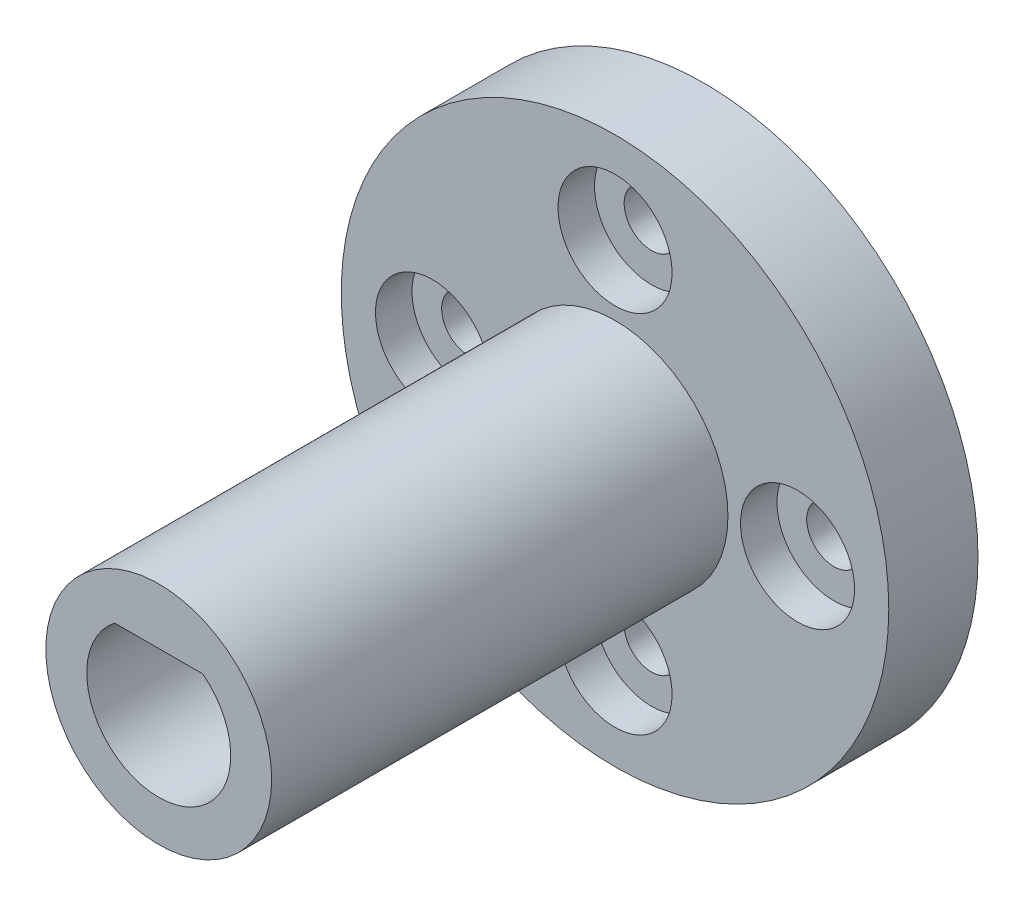
ISO-10303-21;
HEADER;
FILE_DESCRIPTION(('STEP AP214'),'2;1');
FILE_NAME('part.step','',(''),(''),'','','');
FILE_SCHEMA(('AUTOMOTIVE_DESIGN { 1 0 10303 214 1 1 1 1 }'));
ENDSEC;
DATA;
#1=APPLICATION_CONTEXT('core data for automotive mechanical design processes');
#2=APPLICATION_PROTOCOL_DEFINITION('international standard','automotive_design',2000,#1);
#3=PRODUCT_CONTEXT('',#1,'mechanical');
#4=PRODUCT('Part','Part','',(#3));
#5=PRODUCT_RELATED_PRODUCT_CATEGORY('part','',(#4));
#6=PRODUCT_DEFINITION_FORMATION('','',#4);
#7=PRODUCT_DEFINITION_CONTEXT('part definition',#1,'design');
#8=PRODUCT_DEFINITION('design','',#6,#7);
#9=PRODUCT_DEFINITION_SHAPE('','',#8);
#10=(LENGTH_UNIT() NAMED_UNIT(*) SI_UNIT(.MILLI.,.METRE.));
#11=(NAMED_UNIT(*) PLANE_ANGLE_UNIT() SI_UNIT($,.RADIAN.));
#12=(NAMED_UNIT(*) SI_UNIT($,.STERADIAN.) SOLID_ANGLE_UNIT());
#13=UNCERTAINTY_MEASURE_WITH_UNIT(LENGTH_MEASURE(1.E-05),#10,'distance_accuracy_value','');
#14=(GEOMETRIC_REPRESENTATION_CONTEXT(3) GLOBAL_UNCERTAINTY_ASSIGNED_CONTEXT((#13)) GLOBAL_UNIT_ASSIGNED_CONTEXT((#10,
#11,#12)) REPRESENTATION_CONTEXT('',''));
#15=CARTESIAN_POINT('',(0.,0.,0.));
#16=DIRECTION('',(0.,0.,1.));
#17=DIRECTION('',(1.,0.,0.));
#18=AXIS2_PLACEMENT_3D('',#15,#16,#17);
#19=CARTESIAN_POINT('',(0.,0.,3.91));
#20=DIRECTION('',(0.,0.,-1.));
#21=DIRECTION('',(-1.,0.,0.));
#22=AXIS2_PLACEMENT_3D('',#19,#20,#21);
#23=CYLINDRICAL_SURFACE('',#22,12.);
#24=CARTESIAN_POINT('',(0.,0.,3.91));
#25=DIRECTION('',(0.,0.,1.));
#26=DIRECTION('',(1.,0.,0.));
#27=AXIS2_PLACEMENT_3D('',#24,#25,#26);
#28=CIRCLE('',#27,12.);
#29=CARTESIAN_POINT('',(12.,0.,3.91));
#30=VERTEX_POINT('',#29);
#31=EDGE_CURVE('E11',#30,#30,#28,.T.);
#32=ORIENTED_EDGE('',*,*,#31,.F.);
#33=EDGE_LOOP('',(#32));
#34=FACE_BOUND('',#33,.T.);
#35=CARTESIAN_POINT('',(0.,0.,0.));
#36=DIRECTION('',(0.,0.,1.));
#37=DIRECTION('',(1.,0.,0.));
#38=AXIS2_PLACEMENT_3D('',#35,#36,#37);
#39=CIRCLE('',#38,12.);
#40=CARTESIAN_POINT('',(12.,0.,0.));
#41=VERTEX_POINT('',#40);
#42=EDGE_CURVE('E39',#41,#41,#39,.T.);
#43=ORIENTED_EDGE('',*,*,#42,.T.);
#44=EDGE_LOOP('',(#43));
#45=FACE_BOUND('',#44,.T.);
#46=ADVANCED_FACE('F36',(#34,#45),#23,.T.);
#47=CARTESIAN_POINT('',(0.,0.,3.91));
#48=DIRECTION('',(0.,0.,1.));
#49=DIRECTION('',(1.,0.,0.));
#50=AXIS2_PLACEMENT_3D('',#47,#48,#49);
#51=PLANE('',#50);
#52=CARTESIAN_POINT('',(8.,0.,3.91));
#53=DIRECTION('',(0.,0.,1.));
#54=DIRECTION('',(1.,0.,0.));
#55=AXIS2_PLACEMENT_3D('',#52,#53,#54);
#56=CIRCLE('',#55,2.5);
#57=CARTESIAN_POINT('',(10.5,0.,3.91));
#58=VERTEX_POINT('',#57);
#59=EDGE_CURVE('E306',#58,#58,#56,.T.);
#60=ORIENTED_EDGE('',*,*,#59,.F.);
#61=EDGE_LOOP('',(#60));
#62=FACE_BOUND('',#61,.T.);
#63=CARTESIAN_POINT('',(0.,-8.,3.91));
#64=DIRECTION('',(0.,0.,1.));
#65=DIRECTION('',(1.,0.,0.));
#66=AXIS2_PLACEMENT_3D('',#63,#64,#65);
#67=CIRCLE('',#66,2.5);
#68=CARTESIAN_POINT('',(2.5,-8.,3.91));
#69=VERTEX_POINT('',#68);
#70=EDGE_CURVE('E316',#69,#69,#67,.T.);
#71=ORIENTED_EDGE('',*,*,#70,.F.);
#72=EDGE_LOOP('',(#71));
#73=FACE_BOUND('',#72,.T.);
#74=CARTESIAN_POINT('',(-8.,0.,3.91));
#75=DIRECTION('',(0.,0.,1.));
#76=DIRECTION('',(1.,0.,0.));
#77=AXIS2_PLACEMENT_3D('',#74,#75,#76);
#78=CIRCLE('',#77,2.5);
#79=CARTESIAN_POINT('',(-5.50000000000001,0.,3.91));
#80=VERTEX_POINT('',#79);
#81=EDGE_CURVE('E328',#80,#80,#78,.T.);
#82=ORIENTED_EDGE('',*,*,#81,.F.);
#83=EDGE_LOOP('',(#82));
#84=FACE_BOUND('',#83,.T.);
#85=CARTESIAN_POINT('',(0.,8.,3.91));
#86=DIRECTION('',(0.,0.,1.));
#87=DIRECTION('',(1.,0.,0.));
#88=AXIS2_PLACEMENT_3D('',#85,#86,#87);
#89=CIRCLE('',#88,2.5);
#90=CARTESIAN_POINT('',(2.5,8.,3.91));
#91=VERTEX_POINT('',#90);
#92=EDGE_CURVE('E340',#91,#91,#89,.T.);
#93=ORIENTED_EDGE('',*,*,#92,.F.);
#94=EDGE_LOOP('',(#93));
#95=FACE_BOUND('',#94,.T.);
#96=CARTESIAN_POINT('',(0.,0.,3.91));
#97=DIRECTION('',(0.,0.,1.));
#98=DIRECTION('',(1.,0.,0.));
#99=AXIS2_PLACEMENT_3D('',#96,#97,#98);
#100=CIRCLE('',#99,4.95);
#101=CARTESIAN_POINT('',(4.95,0.,3.91));
#102=VERTEX_POINT('',#101);
#103=EDGE_CURVE('E76',#102,#102,#100,.T.);
#104=ORIENTED_EDGE('',*,*,#103,.F.);
#105=EDGE_LOOP('',(#104));
#106=FACE_BOUND('',#105,.T.);
#107=ORIENTED_EDGE('',*,*,#31,.T.);
#108=EDGE_LOOP('',(#107));
#109=FACE_BOUND('',#108,.T.);
#110=ADVANCED_FACE('F95',(#62,#73,#84,#95,#106,#109),#51,.T.);
#111=CARTESIAN_POINT('',(0.,0.,0.));
#112=DIRECTION('',(0.,0.,1.));
#113=DIRECTION('',(1.,0.,0.));
#114=AXIS2_PLACEMENT_3D('',#111,#112,#113);
#115=PLANE('',#114);
#116=CARTESIAN_POINT('',(8.,0.,0.));
#117=DIRECTION('',(0.,0.,1.));
#118=DIRECTION('',(1.,0.,0.));
#119=AXIS2_PLACEMENT_3D('',#116,#117,#118);
#120=CIRCLE('',#119,1.2);
#121=CARTESIAN_POINT('',(9.2,0.,0.));
#122=VERTEX_POINT('',#121);
#123=EDGE_CURVE('E313',#122,#122,#120,.T.);
#124=ORIENTED_EDGE('',*,*,#123,.T.);
#125=EDGE_LOOP('',(#124));
#126=FACE_BOUND('',#125,.T.);
#127=CARTESIAN_POINT('',(0.,-8.,0.));
#128=DIRECTION('',(0.,0.,1.));
#129=DIRECTION('',(1.,0.,0.));
#130=AXIS2_PLACEMENT_3D('',#127,#128,#129);
#131=CIRCLE('',#130,1.2);
#132=CARTESIAN_POINT('',(1.2,-8.,0.));
#133=VERTEX_POINT('',#132);
#134=EDGE_CURVE('E325',#133,#133,#131,.T.);
#135=ORIENTED_EDGE('',*,*,#134,.T.);
#136=EDGE_LOOP('',(#135));
#137=FACE_BOUND('',#136,.T.);
#138=CARTESIAN_POINT('',(-8.,0.,0.));
#139=DIRECTION('',(0.,0.,1.));
#140=DIRECTION('',(1.,0.,0.));
#141=AXIS2_PLACEMENT_3D('',#138,#139,#140);
#142=CIRCLE('',#141,1.2);
#143=CARTESIAN_POINT('',(-6.8,0.,0.));
#144=VERTEX_POINT('',#143);
#145=EDGE_CURVE('E337',#144,#144,#142,.T.);
#146=ORIENTED_EDGE('',*,*,#145,.T.);
#147=EDGE_LOOP('',(#146));
#148=FACE_BOUND('',#147,.T.);
#149=CARTESIAN_POINT('',(0.,8.,0.));
#150=DIRECTION('',(0.,0.,1.));
#151=DIRECTION('',(1.,0.,0.));
#152=AXIS2_PLACEMENT_3D('',#149,#150,#151);
#153=CIRCLE('',#152,1.2);
#154=CARTESIAN_POINT('',(1.2,8.,0.));
#155=VERTEX_POINT('',#154);
#156=EDGE_CURVE('E66',#155,#155,#153,.T.);
#157=ORIENTED_EDGE('',*,*,#156,.T.);
#158=EDGE_LOOP('',(#157));
#159=FACE_BOUND('',#158,.T.);
#160=CARTESIAN_POINT('',(0.,0.,0.));
#161=DIRECTION('',(0.,0.,-1.));
#162=DIRECTION('',(-1.,0.,0.));
#163=AXIS2_PLACEMENT_3D('',#160,#161,#162);
#164=CIRCLE('',#163,4.);
#165=CARTESIAN_POINT('',(-4.,0.,0.));
#166=VERTEX_POINT('',#165);
#167=EDGE_CURVE('E83',#166,#166,#164,.T.);
#168=ORIENTED_EDGE('',*,*,#167,.F.);
#169=EDGE_LOOP('',(#168));
#170=FACE_BOUND('',#169,.T.);
#171=ORIENTED_EDGE('',*,*,#42,.F.);
#172=EDGE_LOOP('',(#171));
#173=FACE_BOUND('',#172,.T.);
#174=ADVANCED_FACE('F92',(#126,#137,#148,#159,#170,#173),#115,.F.);
#175=CARTESIAN_POINT('',(0.,0.,1.91));
#176=DIRECTION('',(0.,0.,-1.));
#177=DIRECTION('',(-1.,0.,0.));
#178=AXIS2_PLACEMENT_3D('',#175,#176,#177);
#179=CYLINDRICAL_SURFACE('',#178,4.);
#180=CARTESIAN_POINT('',(0.,0.,1.91));
#181=DIRECTION('',(0.,0.,-1.));
#182=DIRECTION('',(-1.,0.,0.));
#183=AXIS2_PLACEMENT_3D('',#180,#181,#182);
#184=CIRCLE('',#183,4.);
#185=CARTESIAN_POINT('',(-4.,0.,1.91));
#186=VERTEX_POINT('',#185);
#187=EDGE_CURVE('E84',#186,#186,#184,.T.);
#188=CARTESIAN_POINT('',(-4.,0.,1.91));
#189=CARTESIAN_POINT('',(-4.,0.,1.89010416666667));
#190=CARTESIAN_POINT('',(-4.,0.,1.87020833333333));
#191=CARTESIAN_POINT('',(-4.,0.,1.83041666666667));
#192=CARTESIAN_POINT('',(-4.,0.,1.81052083333333));
#193=CARTESIAN_POINT('',(-4.,0.,1.77072916666667));
#194=CARTESIAN_POINT('',(-4.,0.,1.75083333333333));
#195=CARTESIAN_POINT('',(-4.,0.,1.71104166666667));
#196=CARTESIAN_POINT('',(-4.,0.,1.69114583333333));
#197=CARTESIAN_POINT('',(-4.,0.,1.65135416666667));
#198=CARTESIAN_POINT('',(-4.,0.,1.63145833333333));
#199=CARTESIAN_POINT('',(-4.,0.,1.59166666666667));
#200=CARTESIAN_POINT('',(-4.,0.,1.57177083333333));
#201=CARTESIAN_POINT('',(-4.,0.,1.53197916666667));
#202=CARTESIAN_POINT('',(-4.,0.,1.51208333333333));
#203=CARTESIAN_POINT('',(-4.,0.,1.47229166666667));
#204=CARTESIAN_POINT('',(-4.,0.,1.45239583333333));
#205=CARTESIAN_POINT('',(-4.,0.,1.41260416666667));
#206=CARTESIAN_POINT('',(-4.,0.,1.39270833333333));
#207=CARTESIAN_POINT('',(-4.,0.,1.35291666666667));
#208=CARTESIAN_POINT('',(-4.,0.,1.33302083333333));
#209=CARTESIAN_POINT('',(-4.,0.,1.29322916666667));
#210=CARTESIAN_POINT('',(-4.,0.,1.27333333333333));
#211=CARTESIAN_POINT('',(-4.,0.,1.23354166666667));
#212=CARTESIAN_POINT('',(-4.,0.,1.21364583333333));
#213=CARTESIAN_POINT('',(-4.,0.,1.17385416666667));
#214=CARTESIAN_POINT('',(-4.,0.,1.15395833333333));
#215=CARTESIAN_POINT('',(-4.,0.,1.11416666666667));
#216=CARTESIAN_POINT('',(-4.,0.,1.09427083333333));
#217=CARTESIAN_POINT('',(-4.,0.,1.05447916666667));
#218=CARTESIAN_POINT('',(-4.,0.,1.03458333333333));
#219=CARTESIAN_POINT('',(-4.,0.,0.994791666666667));
#220=CARTESIAN_POINT('',(-4.,0.,0.974895833333334));
#221=CARTESIAN_POINT('',(-4.,0.,0.935104166666667));
#222=CARTESIAN_POINT('',(-4.,0.,0.915208333333333));
#223=CARTESIAN_POINT('',(-4.,0.,0.875416666666667));
#224=CARTESIAN_POINT('',(-4.,0.,0.855520833333333));
#225=CARTESIAN_POINT('',(-4.,0.,0.815729166666667));
#226=CARTESIAN_POINT('',(-4.,0.,0.795833333333333));
#227=CARTESIAN_POINT('',(-4.,0.,0.756041666666667));
#228=CARTESIAN_POINT('',(-4.,0.,0.736145833333333));
#229=CARTESIAN_POINT('',(-4.,0.,0.696354166666667));
#230=CARTESIAN_POINT('',(-4.,0.,0.676458333333333));
#231=CARTESIAN_POINT('',(-4.,0.,0.636666666666667));
#232=CARTESIAN_POINT('',(-4.,0.,0.616770833333333));
#233=CARTESIAN_POINT('',(-4.,0.,0.576979166666667));
#234=CARTESIAN_POINT('',(-4.,0.,0.557083333333333));
#235=CARTESIAN_POINT('',(-4.,0.,0.517291666666667));
#236=CARTESIAN_POINT('',(-4.,0.,0.497395833333333));
#237=CARTESIAN_POINT('',(-4.,0.,0.457604166666667));
#238=CARTESIAN_POINT('',(-4.,0.,0.437708333333333));
#239=CARTESIAN_POINT('',(-4.,0.,0.397916666666667));
#240=CARTESIAN_POINT('',(-4.,0.,0.378020833333333));
#241=CARTESIAN_POINT('',(-4.,0.,0.338229166666667));
#242=CARTESIAN_POINT('',(-4.,0.,0.318333333333333));
#243=CARTESIAN_POINT('',(-4.,0.,0.278541666666667));
#244=CARTESIAN_POINT('',(-4.,0.,0.258645833333333));
#245=CARTESIAN_POINT('',(-4.,0.,0.218854166666667));
#246=CARTESIAN_POINT('',(-4.,0.,0.198958333333333));
#247=CARTESIAN_POINT('',(-4.,0.,0.159166666666667));
#248=CARTESIAN_POINT('',(-4.,0.,0.139270833333333));
#249=CARTESIAN_POINT('',(-4.,0.,0.0994791666666668));
#250=CARTESIAN_POINT('',(-4.,0.,0.0795833333333334));
#251=CARTESIAN_POINT('',(-4.,0.,0.0397916666666667));
#252=CARTESIAN_POINT('',(-4.,0.,0.0198958333333334));
#253=CARTESIAN_POINT('',(-4.,0.,0.));
#254=B_SPLINE_CURVE_WITH_KNOTS('',3,(#188,#189,#190,#191,#192,#193,#194,#195,#196,#197,#198,
#199,#200,#201,#202,#203,#204,#205,#206,#207,#208,#209,#210,#211,#212,#213,#214,#215,#216,#217,
#218,#219,#220,#221,#222,#223,#224,#225,#226,#227,#228,#229,#230,#231,#232,#233,#234,#235,#236,
#237,#238,#239,#240,#241,#242,#243,#244,#245,#246,#247,#248,#249,#250,#251,#252,#253),
.UNSPECIFIED.,.F.,.F.,(4,2,2,2,2,2,2,2,2,2,2,2,2,2,2,2,2,2,2,2,2,2,2,2,2,2,2,2,2,2,2,2,4),(0.,
0.0596874999999998,0.119375,0.1790625,0.23875,0.2984375,0.358125,0.4178125,0.4775,0.5371875,
0.596875,0.6565625,0.71625,0.7759375,0.835625,0.8953125,0.955,1.0146875,1.074375,1.1340625,
1.19375,1.2534375,1.313125,1.3728125,1.4325,1.4921875,1.551875,1.6115625,1.67125,1.7309375,
1.790625,1.8503125,1.91),.UNSPECIFIED.);
#255=EDGE_CURVE('BSEAM90',#186,#166,#254,.T.);
#256=ORIENTED_EDGE('',*,*,#187,.F.);
#257=ORIENTED_EDGE('',*,*,#167,.T.);
#258=ORIENTED_EDGE('',*,*,#255,.T.);
#259=ORIENTED_EDGE('',*,*,#255,.F.);
#260=EDGE_LOOP('',(#256,#258,#257,#259));
#261=FACE_BOUND('',#260,.T.);
#262=ADVANCED_FACE('F90',(#261),#179,.F.);
#263=CARTESIAN_POINT('',(0.,0.,1.91));
#264=DIRECTION('',(0.,0.,-1.));
#265=DIRECTION('',(-1.,0.,0.));
#266=AXIS2_PLACEMENT_3D('',#263,#264,#265);
#267=PLANE('',#266);
#268=ORIENTED_EDGE('',*,*,#187,.T.);
#269=EDGE_LOOP('',(#268));
#270=FACE_BOUND('',#269,.T.);
#271=ADVANCED_FACE('F139',(#270),#267,.T.);
#272=CARTESIAN_POINT('',(0.,2.495,23.91));
#273=DIRECTION('',(0.,-1.,0.));
#274=DIRECTION('',(0.,0.,-1.));
#275=AXIS2_PLACEMENT_3D('',#272,#273,#274);
#276=PLANE('',#275);
#277=DIRECTION('',(-1.,0.,0.));
#278=VECTOR('',#277,1.);
#279=CARTESIAN_POINT('',(0.,2.495,3.91));
#280=LINE('',#279,#278);
#281=CARTESIAN_POINT('',(1.93106188404204,2.495,3.91));
#282=VERTEX_POINT('',#281);
#283=CARTESIAN_POINT('',(-1.93106188404204,2.495,3.91));
#284=VERTEX_POINT('',#283);
#285=EDGE_CURVE('E63',#282,#284,#280,.T.);
#286=ORIENTED_EDGE('',*,*,#285,.F.);
#287=DIRECTION('',(0.,0.,-1.));
#288=VECTOR('',#287,1.);
#289=CARTESIAN_POINT('',(1.93106188404204,2.495,23.91));
#290=LINE('',#289,#288);
#291=CARTESIAN_POINT('',(1.93106188404204,2.495,23.91));
#292=VERTEX_POINT('',#291);
#293=EDGE_CURVE('E72',#292,#282,#290,.T.);
#294=ORIENTED_EDGE('',*,*,#293,.F.);
#295=DIRECTION('',(-1.,0.,0.));
#296=VECTOR('',#295,1.);
#297=CARTESIAN_POINT('',(0.,2.495,23.91));
#298=LINE('',#297,#296);
#299=CARTESIAN_POINT('',(-1.93106188404204,2.495,23.91));
#300=VERTEX_POINT('',#299);
#301=EDGE_CURVE('E70',#292,#300,#298,.T.);
#302=ORIENTED_EDGE('',*,*,#301,.T.);
#303=DIRECTION('',(0.,0.,-1.));
#304=VECTOR('',#303,1.);
#305=CARTESIAN_POINT('',(-1.93106188404204,2.495,23.91));
#306=LINE('',#305,#304);
#307=EDGE_CURVE('E57',#300,#284,#306,.T.);
#308=ORIENTED_EDGE('',*,*,#307,.T.);
#309=EDGE_LOOP('',(#286,#294,#302,#308));
#310=FACE_BOUND('',#309,.T.);
#311=ADVANCED_FACE('F68',(#310),#276,.T.);
#312=CARTESIAN_POINT('',(0.,0.,23.91));
#313=DIRECTION('',(0.,0.,-1.));
#314=DIRECTION('',(-1.,0.,0.));
#315=AXIS2_PLACEMENT_3D('',#312,#313,#314);
#316=CYLINDRICAL_SURFACE('',#315,3.155);
#317=CARTESIAN_POINT('',(0.,0.,3.91));
#318=DIRECTION('',(0.,0.,1.));
#319=DIRECTION('',(1.,0.,0.));
#320=AXIS2_PLACEMENT_3D('',#317,#318,#319);
#321=CIRCLE('',#320,3.155);
#322=EDGE_CURVE('E49',#284,#282,#321,.T.);
#323=ORIENTED_EDGE('',*,*,#322,.F.);
#324=ORIENTED_EDGE('',*,*,#307,.F.);
#325=CARTESIAN_POINT('',(0.,0.,23.91));
#326=DIRECTION('',(0.,0.,1.));
#327=DIRECTION('',(1.,0.,0.));
#328=AXIS2_PLACEMENT_3D('',#325,#326,#327);
#329=CIRCLE('',#328,3.155);
#330=EDGE_CURVE('E352',#300,#292,#329,.T.);
#331=ORIENTED_EDGE('',*,*,#330,.T.);
#332=ORIENTED_EDGE('',*,*,#293,.T.);
#333=EDGE_LOOP('',(#323,#324,#331,#332));
#334=FACE_BOUND('',#333,.T.);
#335=ADVANCED_FACE('F75',(#334),#316,.F.);
#336=CARTESIAN_POINT('',(0.,0.,23.91));
#337=DIRECTION('',(0.,0.,-1.));
#338=DIRECTION('',(-1.,0.,0.));
#339=AXIS2_PLACEMENT_3D('',#336,#337,#338);
#340=CYLINDRICAL_SURFACE('',#339,4.95);
#341=CARTESIAN_POINT('',(0.,0.,23.91));
#342=DIRECTION('',(0.,0.,1.));
#343=DIRECTION('',(1.,0.,0.));
#344=AXIS2_PLACEMENT_3D('',#341,#342,#343);
#345=CIRCLE('',#344,4.95);
#346=CARTESIAN_POINT('',(4.95,0.,23.91));
#347=VERTEX_POINT('',#346);
#348=EDGE_CURVE('E73',#347,#347,#345,.T.);
#349=ORIENTED_EDGE('',*,*,#348,.F.);
#350=EDGE_LOOP('',(#349));
#351=FACE_BOUND('',#350,.T.);
#352=ORIENTED_EDGE('',*,*,#103,.T.);
#353=EDGE_LOOP('',(#352));
#354=FACE_BOUND('',#353,.T.);
#355=ADVANCED_FACE('F124',(#351,#354),#340,.T.);
#356=CARTESIAN_POINT('',(0.,0.,23.91));
#357=DIRECTION('',(0.,0.,1.));
#358=DIRECTION('',(1.,0.,0.));
#359=AXIS2_PLACEMENT_3D('',#356,#357,#358);
#360=PLANE('',#359);
#361=ORIENTED_EDGE('',*,*,#301,.F.);
#362=ORIENTED_EDGE('',*,*,#330,.F.);
#363=EDGE_LOOP('',(#361,#362));
#364=FACE_BOUND('',#363,.T.);
#365=ORIENTED_EDGE('',*,*,#348,.T.);
#366=EDGE_LOOP('',(#365));
#367=FACE_BOUND('',#366,.T.);
#368=ADVANCED_FACE('F116',(#364,#367),#360,.T.);
#369=ORIENTED_EDGE('',*,*,#285,.T.);
#370=ORIENTED_EDGE('',*,*,#322,.T.);
#371=EDGE_LOOP('',(#369,#370));
#372=FACE_BOUND('',#371,.T.);
#373=ADVANCED_FACE('F64',(#372),#51,.T.);
#374=CARTESIAN_POINT('',(0.,8.,3.91));
#375=DIRECTION('',(0.,0.,1.));
#376=DIRECTION('',(1.,0.,0.));
#377=AXIS2_PLACEMENT_3D('',#374,#375,#376);
#378=CYLINDRICAL_SURFACE('',#377,1.2);
#379=ORIENTED_EDGE('',*,*,#156,.F.);
#380=EDGE_LOOP('',(#379));
#381=FACE_BOUND('',#380,.T.);
#382=CARTESIAN_POINT('',(0.,8.,2.31));
#383=DIRECTION('',(0.,0.,1.));
#384=DIRECTION('',(1.,0.,0.));
#385=AXIS2_PLACEMENT_3D('',#382,#383,#384);
#386=CIRCLE('',#385,1.2);
#387=CARTESIAN_POINT('',(1.2,8.,2.31));
#388=VERTEX_POINT('',#387);
#389=EDGE_CURVE('E346',#388,#388,#386,.T.);
#390=ORIENTED_EDGE('',*,*,#389,.T.);
#391=EDGE_LOOP('',(#390));
#392=FACE_BOUND('',#391,.T.);
#393=ADVANCED_FACE('F115',(#381,#392),#378,.F.);
#394=CARTESIAN_POINT('',(1.2,8.,2.31));
#395=DIRECTION('',(0.,0.,-1.));
#396=DIRECTION('',(-1.,0.,0.));
#397=AXIS2_PLACEMENT_3D('',#394,#395,#396);
#398=PLANE('',#397);
#399=ORIENTED_EDGE('',*,*,#389,.F.);
#400=EDGE_LOOP('',(#399));
#401=FACE_BOUND('',#400,.T.);
#402=CARTESIAN_POINT('',(0.,8.,2.31));
#403=DIRECTION('',(0.,0.,1.));
#404=DIRECTION('',(1.,0.,0.));
#405=AXIS2_PLACEMENT_3D('',#402,#403,#404);
#406=CIRCLE('',#405,2.5);
#407=CARTESIAN_POINT('',(2.5,8.,2.31));
#408=VERTEX_POINT('',#407);
#409=EDGE_CURVE('E343',#408,#408,#406,.T.);
#410=ORIENTED_EDGE('',*,*,#409,.T.);
#411=EDGE_LOOP('',(#410));
#412=FACE_BOUND('',#411,.T.);
#413=ADVANCED_FACE('F121',(#401,#412),#398,.F.);
#414=CARTESIAN_POINT('',(0.,8.,3.91));
#415=DIRECTION('',(0.,0.,1.));
#416=DIRECTION('',(1.,0.,0.));
#417=AXIS2_PLACEMENT_3D('',#414,#415,#416);
#418=CYLINDRICAL_SURFACE('',#417,2.5);
#419=ORIENTED_EDGE('',*,*,#409,.F.);
#420=EDGE_LOOP('',(#419));
#421=FACE_BOUND('',#420,.T.);
#422=ORIENTED_EDGE('',*,*,#92,.T.);
#423=EDGE_LOOP('',(#422));
#424=FACE_BOUND('',#423,.T.);
#425=ADVANCED_FACE('F189',(#421,#424),#418,.F.);
#426=CARTESIAN_POINT('',(-8.,0.,3.91));
#427=DIRECTION('',(0.,0.,1.));
#428=DIRECTION('',(1.,0.,0.));
#429=AXIS2_PLACEMENT_3D('',#426,#427,#428);
#430=CYLINDRICAL_SURFACE('',#429,1.2);
#431=ORIENTED_EDGE('',*,*,#145,.F.);
#432=EDGE_LOOP('',(#431));
#433=FACE_BOUND('',#432,.T.);
#434=CARTESIAN_POINT('',(-8.,0.,2.31));
#435=DIRECTION('',(0.,0.,1.));
#436=DIRECTION('',(1.,0.,0.));
#437=AXIS2_PLACEMENT_3D('',#434,#435,#436);
#438=CIRCLE('',#437,1.2);
#439=CARTESIAN_POINT('',(-6.8,0.,2.31));
#440=VERTEX_POINT('',#439);
#441=EDGE_CURVE('E334',#440,#440,#438,.T.);
#442=ORIENTED_EDGE('',*,*,#441,.T.);
#443=EDGE_LOOP('',(#442));
#444=FACE_BOUND('',#443,.T.);
#445=ADVANCED_FACE('F197',(#433,#444),#430,.F.);
#446=CARTESIAN_POINT('',(-6.8,0.,2.31));
#447=DIRECTION('',(0.,0.,-1.));
#448=DIRECTION('',(-1.,0.,0.));
#449=AXIS2_PLACEMENT_3D('',#446,#447,#448);
#450=PLANE('',#449);
#451=ORIENTED_EDGE('',*,*,#441,.F.);
#452=EDGE_LOOP('',(#451));
#453=FACE_BOUND('',#452,.T.);
#454=CARTESIAN_POINT('',(-8.,0.,2.31));
#455=DIRECTION('',(0.,0.,1.));
#456=DIRECTION('',(1.,0.,0.));
#457=AXIS2_PLACEMENT_3D('',#454,#455,#456);
#458=CIRCLE('',#457,2.5);
#459=CARTESIAN_POINT('',(-5.5,0.,2.31));
#460=VERTEX_POINT('',#459);
#461=EDGE_CURVE('E331',#460,#460,#458,.T.);
#462=ORIENTED_EDGE('',*,*,#461,.T.);
#463=EDGE_LOOP('',(#462));
#464=FACE_BOUND('',#463,.T.);
#465=ADVANCED_FACE('F217',(#453,#464),#450,.F.);
#466=CARTESIAN_POINT('',(-8.,0.,3.91));
#467=DIRECTION('',(0.,0.,1.));
#468=DIRECTION('',(1.,0.,0.));
#469=AXIS2_PLACEMENT_3D('',#466,#467,#468);
#470=CYLINDRICAL_SURFACE('',#469,2.5);
#471=ORIENTED_EDGE('',*,*,#461,.F.);
#472=EDGE_LOOP('',(#471));
#473=FACE_BOUND('',#472,.T.);
#474=ORIENTED_EDGE('',*,*,#81,.T.);
#475=EDGE_LOOP('',(#474));
#476=FACE_BOUND('',#475,.T.);
#477=ADVANCED_FACE('F227',(#473,#476),#470,.F.);
#478=CARTESIAN_POINT('',(0.,-8.,3.91));
#479=DIRECTION('',(0.,0.,1.));
#480=DIRECTION('',(1.,0.,0.));
#481=AXIS2_PLACEMENT_3D('',#478,#479,#480);
#482=CYLINDRICAL_SURFACE('',#481,1.2);
#483=ORIENTED_EDGE('',*,*,#134,.F.);
#484=EDGE_LOOP('',(#483));
#485=FACE_BOUND('',#484,.T.);
#486=CARTESIAN_POINT('',(0.,-8.,2.31));
#487=DIRECTION('',(0.,0.,1.));
#488=DIRECTION('',(1.,0.,0.));
#489=AXIS2_PLACEMENT_3D('',#486,#487,#488);
#490=CIRCLE('',#489,1.2);
#491=CARTESIAN_POINT('',(1.2,-8.,2.31));
#492=VERTEX_POINT('',#491);
#493=EDGE_CURVE('E322',#492,#492,#490,.T.);
#494=ORIENTED_EDGE('',*,*,#493,.T.);
#495=EDGE_LOOP('',(#494));
#496=FACE_BOUND('',#495,.T.);
#497=ADVANCED_FACE('F237',(#485,#496),#482,.F.);
#498=CARTESIAN_POINT('',(1.2,-8.,2.31));
#499=DIRECTION('',(0.,0.,-1.));
#500=DIRECTION('',(-1.,0.,0.));
#501=AXIS2_PLACEMENT_3D('',#498,#499,#500);
#502=PLANE('',#501);
#503=ORIENTED_EDGE('',*,*,#493,.F.);
#504=EDGE_LOOP('',(#503));
#505=FACE_BOUND('',#504,.T.);
#506=CARTESIAN_POINT('',(0.,-8.,2.31));
#507=DIRECTION('',(0.,0.,1.));
#508=DIRECTION('',(1.,0.,0.));
#509=AXIS2_PLACEMENT_3D('',#506,#507,#508);
#510=CIRCLE('',#509,2.5);
#511=CARTESIAN_POINT('',(2.5,-8.,2.31));
#512=VERTEX_POINT('',#511);
#513=EDGE_CURVE('E319',#512,#512,#510,.T.);
#514=ORIENTED_EDGE('',*,*,#513,.T.);
#515=EDGE_LOOP('',(#514));
#516=FACE_BOUND('',#515,.T.);
#517=ADVANCED_FACE('F247',(#505,#516),#502,.F.);
#518=CARTESIAN_POINT('',(0.,-8.,3.91));
#519=DIRECTION('',(0.,0.,1.));
#520=DIRECTION('',(1.,0.,0.));
#521=AXIS2_PLACEMENT_3D('',#518,#519,#520);
#522=CYLINDRICAL_SURFACE('',#521,2.5);
#523=ORIENTED_EDGE('',*,*,#513,.F.);
#524=EDGE_LOOP('',(#523));
#525=FACE_BOUND('',#524,.T.);
#526=ORIENTED_EDGE('',*,*,#70,.T.);
#527=EDGE_LOOP('',(#526));
#528=FACE_BOUND('',#527,.T.);
#529=ADVANCED_FACE('F257',(#525,#528),#522,.F.);
#530=CARTESIAN_POINT('',(8.,0.,3.91));
#531=DIRECTION('',(0.,0.,1.));
#532=DIRECTION('',(1.,0.,0.));
#533=AXIS2_PLACEMENT_3D('',#530,#531,#532);
#534=CYLINDRICAL_SURFACE('',#533,1.2);
#535=ORIENTED_EDGE('',*,*,#123,.F.);
#536=EDGE_LOOP('',(#535));
#537=FACE_BOUND('',#536,.T.);
#538=CARTESIAN_POINT('',(8.,0.,2.31));
#539=DIRECTION('',(0.,0.,1.));
#540=DIRECTION('',(1.,0.,0.));
#541=AXIS2_PLACEMENT_3D('',#538,#539,#540);
#542=CIRCLE('',#541,1.2);
#543=CARTESIAN_POINT('',(9.2,0.,2.31));
#544=VERTEX_POINT('',#543);
#545=EDGE_CURVE('E308',#544,#544,#542,.T.);
#546=ORIENTED_EDGE('',*,*,#545,.T.);
#547=EDGE_LOOP('',(#546));
#548=FACE_BOUND('',#547,.T.);
#549=ADVANCED_FACE('F267',(#537,#548),#534,.F.);
#550=CARTESIAN_POINT('',(9.2,0.,2.31));
#551=DIRECTION('',(0.,0.,-1.));
#552=DIRECTION('',(-1.,0.,0.));
#553=AXIS2_PLACEMENT_3D('',#550,#551,#552);
#554=PLANE('',#553);
#555=ORIENTED_EDGE('',*,*,#545,.F.);
#556=EDGE_LOOP('',(#555));
#557=FACE_BOUND('',#556,.T.);
#558=CARTESIAN_POINT('',(8.,0.,2.31));
#559=DIRECTION('',(0.,0.,1.));
#560=DIRECTION('',(1.,0.,0.));
#561=AXIS2_PLACEMENT_3D('',#558,#559,#560);
#562=CIRCLE('',#561,2.5);
#563=CARTESIAN_POINT('',(10.5,0.,2.31));
#564=VERTEX_POINT('',#563);
#565=EDGE_CURVE('E304',#564,#564,#562,.T.);
#566=ORIENTED_EDGE('',*,*,#565,.T.);
#567=EDGE_LOOP('',(#566));
#568=FACE_BOUND('',#567,.T.);
#569=ADVANCED_FACE('F277',(#557,#568),#554,.F.);
#570=CARTESIAN_POINT('',(8.,0.,3.91));
#571=DIRECTION('',(0.,0.,1.));
#572=DIRECTION('',(1.,0.,0.));
#573=AXIS2_PLACEMENT_3D('',#570,#571,#572);
#574=CYLINDRICAL_SURFACE('',#573,2.5);
#575=ORIENTED_EDGE('',*,*,#565,.F.);
#576=EDGE_LOOP('',(#575));
#577=FACE_BOUND('',#576,.T.);
#578=ORIENTED_EDGE('',*,*,#59,.T.);
#579=EDGE_LOOP('',(#578));
#580=FACE_BOUND('',#579,.T.);
#581=ADVANCED_FACE('F287',(#577,#580),#574,.F.);
#582=CLOSED_SHELL('',(#46,#110,#174,#262,#271,#311,#335,#355,#368,#373,#393,#413,#425,#445,#465,
#477,#497,#517,#529,#549,#569,#581));
#583=MANIFOLD_SOLID_BREP('B2',#582);
#584=ADVANCED_BREP_SHAPE_REPRESENTATION('',(#18,#583),#14);
#585=SHAPE_DEFINITION_REPRESENTATION(#9,#584);
ENDSEC;
END-ISO-10303-21;
